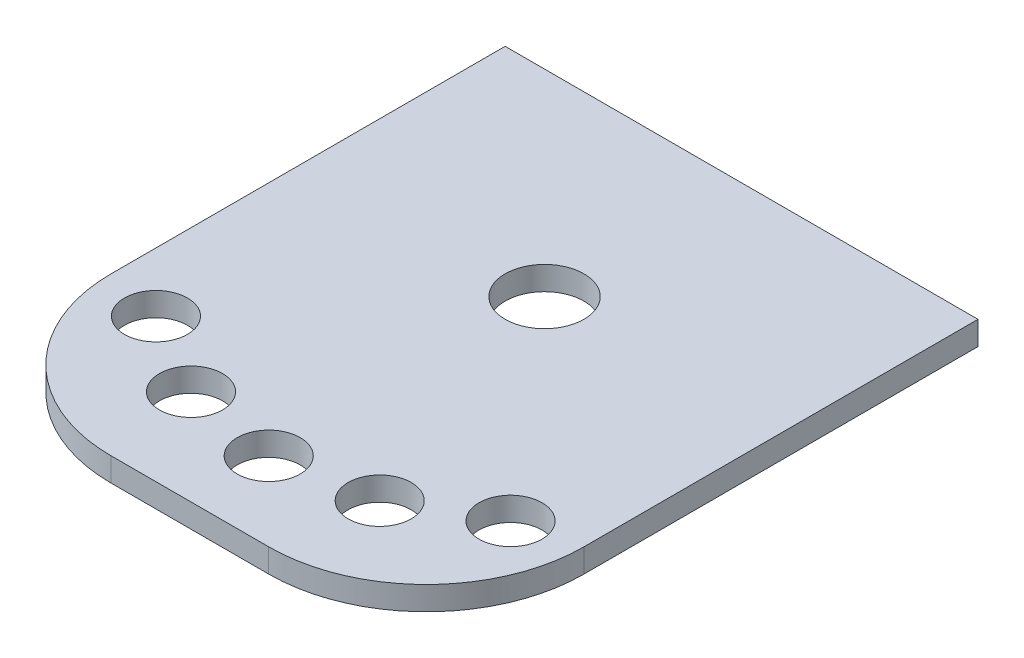
ISO-10303-21;
HEADER;
FILE_DESCRIPTION(('STEP AP214'),'2;1');
FILE_NAME('part.step','',(''),(''),'','','');
FILE_SCHEMA(('AUTOMOTIVE_DESIGN { 1 0 10303 214 1 1 1 1 }'));
ENDSEC;
DATA;
#1=APPLICATION_CONTEXT('core data for automotive mechanical design processes');
#2=APPLICATION_PROTOCOL_DEFINITION('international standard','automotive_design',2000,#1);
#3=PRODUCT_CONTEXT('',#1,'mechanical');
#4=PRODUCT('Part','Part','',(#3));
#5=PRODUCT_RELATED_PRODUCT_CATEGORY('part','',(#4));
#6=PRODUCT_DEFINITION_FORMATION('','',#4);
#7=PRODUCT_DEFINITION_CONTEXT('part definition',#1,'design');
#8=PRODUCT_DEFINITION('design','',#6,#7);
#9=PRODUCT_DEFINITION_SHAPE('','',#8);
#10=(LENGTH_UNIT() NAMED_UNIT(*) SI_UNIT(.MILLI.,.METRE.));
#11=(NAMED_UNIT(*) PLANE_ANGLE_UNIT() SI_UNIT($,.RADIAN.));
#12=(NAMED_UNIT(*) SI_UNIT($,.STERADIAN.) SOLID_ANGLE_UNIT());
#13=UNCERTAINTY_MEASURE_WITH_UNIT(LENGTH_MEASURE(1.E-05),#10,'distance_accuracy_value','');
#14=(GEOMETRIC_REPRESENTATION_CONTEXT(3) GLOBAL_UNCERTAINTY_ASSIGNED_CONTEXT((#13)) GLOBAL_UNIT_ASSIGNED_CONTEXT((#10,
#11,#12)) REPRESENTATION_CONTEXT('',''));
#15=CARTESIAN_POINT('',(0.,0.,0.));
#16=DIRECTION('',(0.,0.,1.));
#17=DIRECTION('',(1.,0.,0.));
#18=AXIS2_PLACEMENT_3D('',#15,#16,#17);
#19=CARTESIAN_POINT('',(20.,-3.,0.));
#20=DIRECTION('',(0.,1.,0.));
#21=DIRECTION('',(0.,0.,1.));
#22=AXIS2_PLACEMENT_3D('',#19,#20,#21);
#23=CYLINDRICAL_SURFACE('',#22,20.);
#24=CARTESIAN_POINT('',(20.,0.,0.));
#25=DIRECTION('',(0.,1.,0.));
#26=DIRECTION('',(0.,0.,1.));
#27=AXIS2_PLACEMENT_3D('',#24,#25,#26);
#28=CIRCLE('',#27,20.);
#29=CARTESIAN_POINT('',(0.,0.,0.));
#30=VERTEX_POINT('',#29);
#31=CARTESIAN_POINT('',(20.,0.,20.));
#32=VERTEX_POINT('',#31);
#33=EDGE_CURVE('E120',#30,#32,#28,.T.);
#34=ORIENTED_EDGE('',*,*,#33,.F.);
#35=DIRECTION('',(0.,1.,0.));
#36=VECTOR('',#35,1.);
#37=CARTESIAN_POINT('',(0.,-3.,0.));
#38=LINE('',#37,#36);
#39=CARTESIAN_POINT('',(0.,-3.,0.));
#40=VERTEX_POINT('',#39);
#41=EDGE_CURVE('E11',#40,#30,#38,.T.);
#42=ORIENTED_EDGE('',*,*,#41,.F.);
#43=CARTESIAN_POINT('',(20.,-3.,0.));
#44=DIRECTION('',(0.,1.,0.));
#45=DIRECTION('',(0.,0.,1.));
#46=AXIS2_PLACEMENT_3D('',#43,#44,#45);
#47=CIRCLE('',#46,20.);
#48=CARTESIAN_POINT('',(20.,-3.,20.));
#49=VERTEX_POINT('',#48);
#50=EDGE_CURVE('E135',#40,#49,#47,.T.);
#51=ORIENTED_EDGE('',*,*,#50,.T.);
#52=DIRECTION('',(0.,1.,0.));
#53=VECTOR('',#52,1.);
#54=CARTESIAN_POINT('',(20.,-3.,20.));
#55=LINE('',#54,#53);
#56=EDGE_CURVE('E38',#49,#32,#55,.T.);
#57=ORIENTED_EDGE('',*,*,#56,.T.);
#58=EDGE_LOOP('',(#34,#42,#51,#57));
#59=FACE_BOUND('',#58,.T.);
#60=ADVANCED_FACE('F35',(#59),#23,.T.);
#61=CARTESIAN_POINT('',(0.,-3.,0.));
#62=DIRECTION('',(-1.,0.,0.));
#63=DIRECTION('',(0.,0.,1.));
#64=AXIS2_PLACEMENT_3D('',#61,#62,#63);
#65=PLANE('',#64);
#66=DIRECTION('',(0.,0.,1.));
#67=VECTOR('',#66,1.);
#68=CARTESIAN_POINT('',(0.,0.,0.));
#69=LINE('',#68,#67);
#70=CARTESIAN_POINT('',(0.,0.,-50.));
#71=VERTEX_POINT('',#70);
#72=EDGE_CURVE('E133',#71,#30,#69,.T.);
#73=ORIENTED_EDGE('',*,*,#72,.F.);
#74=DIRECTION('',(0.,1.,0.));
#75=VECTOR('',#74,1.);
#76=CARTESIAN_POINT('',(0.,-3.,-50.));
#77=LINE('',#76,#75);
#78=CARTESIAN_POINT('',(0.,-3.,-50.));
#79=VERTEX_POINT('',#78);
#80=EDGE_CURVE('E44',#79,#71,#77,.T.);
#81=ORIENTED_EDGE('',*,*,#80,.F.);
#82=DIRECTION('',(0.,0.,1.));
#83=VECTOR('',#82,1.);
#84=CARTESIAN_POINT('',(0.,-3.,0.));
#85=LINE('',#84,#83);
#86=EDGE_CURVE('E110',#79,#40,#85,.T.);
#87=ORIENTED_EDGE('',*,*,#86,.T.);
#88=ORIENTED_EDGE('',*,*,#41,.T.);
#89=EDGE_LOOP('',(#73,#81,#87,#88));
#90=FACE_BOUND('',#89,.T.);
#91=ADVANCED_FACE('F143',(#90),#65,.T.);
#92=CARTESIAN_POINT('',(0.,-3.,-50.));
#93=DIRECTION('',(0.,0.,-1.));
#94=DIRECTION('',(-1.,0.,0.));
#95=AXIS2_PLACEMENT_3D('',#92,#93,#94);
#96=PLANE('',#95);
#97=DIRECTION('',(-1.,0.,0.));
#98=VECTOR('',#97,1.);
#99=CARTESIAN_POINT('',(0.,0.,-50.));
#100=LINE('',#99,#98);
#101=CARTESIAN_POINT('',(60.,0.,-50.));
#102=VERTEX_POINT('',#101);
#103=EDGE_CURVE('E97',#102,#71,#100,.T.);
#104=ORIENTED_EDGE('',*,*,#103,.F.);
#105=DIRECTION('',(0.,1.,0.));
#106=VECTOR('',#105,1.);
#107=CARTESIAN_POINT('',(60.,-3.,-50.));
#108=LINE('',#107,#106);
#109=CARTESIAN_POINT('',(60.,-3.,-50.));
#110=VERTEX_POINT('',#109);
#111=EDGE_CURVE('E92',#110,#102,#108,.T.);
#112=ORIENTED_EDGE('',*,*,#111,.F.);
#113=DIRECTION('',(-1.,0.,0.));
#114=VECTOR('',#113,1.);
#115=CARTESIAN_POINT('',(0.,-3.,-50.));
#116=LINE('',#115,#114);
#117=EDGE_CURVE('E95',#110,#79,#116,.T.);
#118=ORIENTED_EDGE('',*,*,#117,.T.);
#119=ORIENTED_EDGE('',*,*,#80,.T.);
#120=EDGE_LOOP('',(#104,#112,#118,#119));
#121=FACE_BOUND('',#120,.T.);
#122=ADVANCED_FACE('F94',(#121),#96,.T.);
#123=CARTESIAN_POINT('',(60.,-3.,0.));
#124=DIRECTION('',(1.,0.,0.));
#125=DIRECTION('',(0.,0.,-1.));
#126=AXIS2_PLACEMENT_3D('',#123,#124,#125);
#127=PLANE('',#126);
#128=DIRECTION('',(0.,0.,-1.));
#129=VECTOR('',#128,1.);
#130=CARTESIAN_POINT('',(60.,0.,0.));
#131=LINE('',#130,#129);
#132=CARTESIAN_POINT('',(60.,0.,0.));
#133=VERTEX_POINT('',#132);
#134=EDGE_CURVE('E130',#133,#102,#131,.T.);
#135=ORIENTED_EDGE('',*,*,#134,.F.);
#136=DIRECTION('',(0.,1.,0.));
#137=VECTOR('',#136,1.);
#138=CARTESIAN_POINT('',(60.,-3.,0.));
#139=LINE('',#138,#137);
#140=CARTESIAN_POINT('',(60.,-3.,0.));
#141=VERTEX_POINT('',#140);
#142=EDGE_CURVE('E102',#141,#133,#139,.T.);
#143=ORIENTED_EDGE('',*,*,#142,.F.);
#144=DIRECTION('',(0.,0.,-1.));
#145=VECTOR('',#144,1.);
#146=CARTESIAN_POINT('',(60.,-3.,0.));
#147=LINE('',#146,#145);
#148=EDGE_CURVE('E108',#141,#110,#147,.T.);
#149=ORIENTED_EDGE('',*,*,#148,.T.);
#150=ORIENTED_EDGE('',*,*,#111,.T.);
#151=EDGE_LOOP('',(#135,#143,#149,#150));
#152=FACE_BOUND('',#151,.T.);
#153=ADVANCED_FACE('F112',(#152),#127,.T.);
#154=CARTESIAN_POINT('',(40.,-3.,0.));
#155=DIRECTION('',(0.,1.,0.));
#156=DIRECTION('',(0.,0.,1.));
#157=AXIS2_PLACEMENT_3D('',#154,#155,#156);
#158=CYLINDRICAL_SURFACE('',#157,20.);
#159=CARTESIAN_POINT('',(40.,0.,0.));
#160=DIRECTION('',(0.,1.,0.));
#161=DIRECTION('',(0.,0.,1.));
#162=AXIS2_PLACEMENT_3D('',#159,#160,#161);
#163=CIRCLE('',#162,20.);
#164=CARTESIAN_POINT('',(40.,0.,20.));
#165=VERTEX_POINT('',#164);
#166=EDGE_CURVE('E127',#165,#133,#163,.T.);
#167=ORIENTED_EDGE('',*,*,#166,.F.);
#168=DIRECTION('',(0.,1.,0.));
#169=VECTOR('',#168,1.);
#170=CARTESIAN_POINT('',(40.,-3.,20.));
#171=LINE('',#170,#169);
#172=CARTESIAN_POINT('',(40.,-3.,20.));
#173=VERTEX_POINT('',#172);
#174=EDGE_CURVE('E138',#173,#165,#171,.T.);
#175=ORIENTED_EDGE('',*,*,#174,.F.);
#176=CARTESIAN_POINT('',(40.,-3.,0.));
#177=DIRECTION('',(0.,1.,0.));
#178=DIRECTION('',(0.,0.,1.));
#179=AXIS2_PLACEMENT_3D('',#176,#177,#178);
#180=CIRCLE('',#179,20.);
#181=EDGE_CURVE('E113',#173,#141,#180,.T.);
#182=ORIENTED_EDGE('',*,*,#181,.T.);
#183=ORIENTED_EDGE('',*,*,#142,.T.);
#184=EDGE_LOOP('',(#167,#175,#182,#183));
#185=FACE_BOUND('',#184,.T.);
#186=ADVANCED_FACE('F156',(#185),#158,.T.);
#187=CARTESIAN_POINT('',(20.,-3.,20.));
#188=DIRECTION('',(0.,0.,1.));
#189=DIRECTION('',(1.,0.,0.));
#190=AXIS2_PLACEMENT_3D('',#187,#188,#189);
#191=PLANE('',#190);
#192=DIRECTION('',(1.,0.,0.));
#193=VECTOR('',#192,1.);
#194=CARTESIAN_POINT('',(20.,0.,20.));
#195=LINE('',#194,#193);
#196=EDGE_CURVE('E123',#32,#165,#195,.T.);
#197=ORIENTED_EDGE('',*,*,#196,.F.);
#198=ORIENTED_EDGE('',*,*,#56,.F.);
#199=DIRECTION('',(1.,0.,0.));
#200=VECTOR('',#199,1.);
#201=CARTESIAN_POINT('',(20.,-3.,20.));
#202=LINE('',#201,#200);
#203=EDGE_CURVE('E115',#49,#173,#202,.T.);
#204=ORIENTED_EDGE('',*,*,#203,.T.);
#205=ORIENTED_EDGE('',*,*,#174,.T.);
#206=EDGE_LOOP('',(#197,#198,#204,#205));
#207=FACE_BOUND('',#206,.T.);
#208=ADVANCED_FACE('F140',(#207),#191,.T.);
#209=CARTESIAN_POINT('',(20.,-3.,0.));
#210=DIRECTION('',(0.,1.,0.));
#211=DIRECTION('',(0.,0.,1.));
#212=AXIS2_PLACEMENT_3D('',#209,#210,#211);
#213=PLANE('',#212);
#214=CARTESIAN_POINT('',(30.,-3.,-25.));
#215=DIRECTION('',(0.,1.,0.));
#216=DIRECTION('',(0.,0.,1.));
#217=AXIS2_PLACEMENT_3D('',#214,#215,#216);
#218=CIRCLE('',#217,5.);
#219=CARTESIAN_POINT('',(30.,-3.,-20.));
#220=VERTEX_POINT('',#219);
#221=EDGE_CURVE('E198',#220,#220,#218,.T.);
#222=ORIENTED_EDGE('',*,*,#221,.T.);
#223=EDGE_LOOP('',(#222));
#224=FACE_BOUND('',#223,.T.);
#225=CARTESIAN_POINT('',(7.5024336609711,-3.,1.8115555091642));
#226=DIRECTION('',(0.,1.,0.));
#227=DIRECTION('',(0.,0.,1.));
#228=AXIS2_PLACEMENT_3D('',#225,#226,#227);
#229=CIRCLE('',#228,4.);
#230=CARTESIAN_POINT('',(7.5024336609711,-3.,5.81155550916421));
#231=VERTEX_POINT('',#230);
#232=EDGE_CURVE('E206',#231,#231,#229,.T.);
#233=ORIENTED_EDGE('',*,*,#232,.T.);
#234=EDGE_LOOP('',(#233));
#235=FACE_BOUND('',#234,.T.);
#236=CARTESIAN_POINT('',(18.0292949836016,-3.,7.88924172750677));
#237=DIRECTION('',(0.,1.,0.));
#238=DIRECTION('',(0.,0.,1.));
#239=AXIS2_PLACEMENT_3D('',#236,#237,#238);
#240=CIRCLE('',#239,4.);
#241=CARTESIAN_POINT('',(18.0292949836016,-3.,11.8892417275068));
#242=VERTEX_POINT('',#241);
#243=EDGE_CURVE('E212',#242,#242,#240,.T.);
#244=ORIENTED_EDGE('',*,*,#243,.T.);
#245=EDGE_LOOP('',(#244));
#246=FACE_BOUND('',#245,.T.);
#247=CARTESIAN_POINT('',(41.9707050163984,-3.,7.88924172750677));
#248=DIRECTION('',(0.,1.,0.));
#249=DIRECTION('',(0.,0.,-1.));
#250=AXIS2_PLACEMENT_3D('',#247,#248,#249);
#251=CIRCLE('',#250,4.);
#252=CARTESIAN_POINT('',(41.9707050163984,-3.,3.88924172750677));
#253=VERTEX_POINT('',#252);
#254=EDGE_CURVE('E218',#253,#253,#251,.T.);
#255=ORIENTED_EDGE('',*,*,#254,.T.);
#256=EDGE_LOOP('',(#255));
#257=FACE_BOUND('',#256,.T.);
#258=CARTESIAN_POINT('',(30.,-3.,9.99999999999998));
#259=DIRECTION('',(0.,1.,0.));
#260=DIRECTION('',(0.,0.,1.));
#261=AXIS2_PLACEMENT_3D('',#258,#259,#260);
#262=CIRCLE('',#261,4.00000000000001);
#263=CARTESIAN_POINT('',(30.,-3.,14.));
#264=VERTEX_POINT('',#263);
#265=EDGE_CURVE('E224',#264,#264,#262,.T.);
#266=ORIENTED_EDGE('',*,*,#265,.T.);
#267=EDGE_LOOP('',(#266));
#268=FACE_BOUND('',#267,.T.);
#269=CARTESIAN_POINT('',(52.4975663390289,-3.,1.8115555091642));
#270=DIRECTION('',(0.,1.,0.));
#271=DIRECTION('',(0.,0.,-1.));
#272=AXIS2_PLACEMENT_3D('',#269,#270,#271);
#273=CIRCLE('',#272,4.);
#274=CARTESIAN_POINT('',(52.4975663390289,-3.,-2.1884444908358));
#275=VERTEX_POINT('',#274);
#276=EDGE_CURVE('E124',#275,#275,#273,.T.);
#277=ORIENTED_EDGE('',*,*,#276,.T.);
#278=EDGE_LOOP('',(#277));
#279=FACE_BOUND('',#278,.T.);
#280=ORIENTED_EDGE('',*,*,#50,.F.);
#281=ORIENTED_EDGE('',*,*,#86,.F.);
#282=ORIENTED_EDGE('',*,*,#117,.F.);
#283=ORIENTED_EDGE('',*,*,#148,.F.);
#284=ORIENTED_EDGE('',*,*,#181,.F.);
#285=ORIENTED_EDGE('',*,*,#203,.F.);
#286=EDGE_LOOP('',(#280,#281,#282,#283,#284,#285));
#287=FACE_BOUND('',#286,.T.);
#288=ADVANCED_FACE('F106',(#224,#235,#246,#257,#268,#279,#287),#213,.F.);
#289=CARTESIAN_POINT('',(20.,0.,0.));
#290=DIRECTION('',(0.,1.,0.));
#291=DIRECTION('',(0.,0.,1.));
#292=AXIS2_PLACEMENT_3D('',#289,#290,#291);
#293=PLANE('',#292);
#294=CARTESIAN_POINT('',(30.,0.,-25.));
#295=DIRECTION('',(0.,1.,0.));
#296=DIRECTION('',(0.,0.,1.));
#297=AXIS2_PLACEMENT_3D('',#294,#295,#296);
#298=CIRCLE('',#297,5.);
#299=CARTESIAN_POINT('',(30.,0.,-20.));
#300=VERTEX_POINT('',#299);
#301=EDGE_CURVE('E201',#300,#300,#298,.T.);
#302=ORIENTED_EDGE('',*,*,#301,.F.);
#303=EDGE_LOOP('',(#302));
#304=FACE_BOUND('',#303,.T.);
#305=CARTESIAN_POINT('',(7.5024336609711,0.,1.8115555091642));
#306=DIRECTION('',(0.,1.,0.));
#307=DIRECTION('',(0.,0.,1.));
#308=AXIS2_PLACEMENT_3D('',#305,#306,#307);
#309=CIRCLE('',#308,4.);
#310=CARTESIAN_POINT('',(7.5024336609711,0.,5.81155550916421));
#311=VERTEX_POINT('',#310);
#312=EDGE_CURVE('E203',#311,#311,#309,.T.);
#313=ORIENTED_EDGE('',*,*,#312,.F.);
#314=EDGE_LOOP('',(#313));
#315=FACE_BOUND('',#314,.T.);
#316=CARTESIAN_POINT('',(18.0292949836016,0.,7.88924172750677));
#317=DIRECTION('',(0.,1.,0.));
#318=DIRECTION('',(0.,0.,1.));
#319=AXIS2_PLACEMENT_3D('',#316,#317,#318);
#320=CIRCLE('',#319,4.);
#321=CARTESIAN_POINT('',(18.0292949836016,0.,11.8892417275068));
#322=VERTEX_POINT('',#321);
#323=EDGE_CURVE('E209',#322,#322,#320,.T.);
#324=ORIENTED_EDGE('',*,*,#323,.F.);
#325=EDGE_LOOP('',(#324));
#326=FACE_BOUND('',#325,.T.);
#327=CARTESIAN_POINT('',(41.9707050163984,0.,7.88924172750677));
#328=DIRECTION('',(0.,1.,0.));
#329=DIRECTION('',(0.,0.,-1.));
#330=AXIS2_PLACEMENT_3D('',#327,#328,#329);
#331=CIRCLE('',#330,4.);
#332=CARTESIAN_POINT('',(41.9707050163984,0.,3.88924172750677));
#333=VERTEX_POINT('',#332);
#334=EDGE_CURVE('E215',#333,#333,#331,.T.);
#335=ORIENTED_EDGE('',*,*,#334,.F.);
#336=EDGE_LOOP('',(#335));
#337=FACE_BOUND('',#336,.T.);
#338=CARTESIAN_POINT('',(30.,0.,9.99999999999998));
#339=DIRECTION('',(0.,1.,0.));
#340=DIRECTION('',(0.,0.,1.));
#341=AXIS2_PLACEMENT_3D('',#338,#339,#340);
#342=CIRCLE('',#341,4.00000000000001);
#343=CARTESIAN_POINT('',(30.,0.,14.));
#344=VERTEX_POINT('',#343);
#345=EDGE_CURVE('E221',#344,#344,#342,.T.);
#346=ORIENTED_EDGE('',*,*,#345,.F.);
#347=EDGE_LOOP('',(#346));
#348=FACE_BOUND('',#347,.T.);
#349=CARTESIAN_POINT('',(52.4975663390289,0.,1.8115555091642));
#350=DIRECTION('',(0.,1.,0.));
#351=DIRECTION('',(0.,0.,-1.));
#352=AXIS2_PLACEMENT_3D('',#349,#350,#351);
#353=CIRCLE('',#352,4.);
#354=CARTESIAN_POINT('',(52.4975663390289,0.,-2.1884444908358));
#355=VERTEX_POINT('',#354);
#356=EDGE_CURVE('E227',#355,#355,#353,.T.);
#357=ORIENTED_EDGE('',*,*,#356,.F.);
#358=EDGE_LOOP('',(#357));
#359=FACE_BOUND('',#358,.T.);
#360=ORIENTED_EDGE('',*,*,#33,.T.);
#361=ORIENTED_EDGE('',*,*,#196,.T.);
#362=ORIENTED_EDGE('',*,*,#166,.T.);
#363=ORIENTED_EDGE('',*,*,#134,.T.);
#364=ORIENTED_EDGE('',*,*,#103,.T.);
#365=ORIENTED_EDGE('',*,*,#72,.T.);
#366=EDGE_LOOP('',(#360,#361,#362,#363,#364,#365));
#367=FACE_BOUND('',#366,.T.);
#368=ADVANCED_FACE('F142',(#304,#315,#326,#337,#348,#359,#367),#293,.T.);
#369=CARTESIAN_POINT('',(52.4975663390289,-3.,1.8115555091642));
#370=DIRECTION('',(0.,1.,0.));
#371=DIRECTION('',(0.,0.,1.));
#372=AXIS2_PLACEMENT_3D('',#369,#370,#371);
#373=CYLINDRICAL_SURFACE('',#372,4.);
#374=ORIENTED_EDGE('',*,*,#276,.F.);
#375=EDGE_LOOP('',(#374));
#376=FACE_BOUND('',#375,.T.);
#377=ORIENTED_EDGE('',*,*,#356,.T.);
#378=EDGE_LOOP('',(#377));
#379=FACE_BOUND('',#378,.T.);
#380=ADVANCED_FACE('F167',(#376,#379),#373,.F.);
#381=CARTESIAN_POINT('',(30.,-3.,9.99999999999998));
#382=DIRECTION('',(0.,1.,0.));
#383=DIRECTION('',(0.,0.,1.));
#384=AXIS2_PLACEMENT_3D('',#381,#382,#383);
#385=CYLINDRICAL_SURFACE('',#384,4.00000000000001);
#386=ORIENTED_EDGE('',*,*,#265,.F.);
#387=EDGE_LOOP('',(#386));
#388=FACE_BOUND('',#387,.T.);
#389=ORIENTED_EDGE('',*,*,#345,.T.);
#390=EDGE_LOOP('',(#389));
#391=FACE_BOUND('',#390,.T.);
#392=ADVANCED_FACE('F174',(#388,#391),#385,.F.);
#393=CARTESIAN_POINT('',(41.9707050163984,-3.,7.88924172750677));
#394=DIRECTION('',(0.,1.,0.));
#395=DIRECTION('',(0.,0.,1.));
#396=AXIS2_PLACEMENT_3D('',#393,#394,#395);
#397=CYLINDRICAL_SURFACE('',#396,4.);
#398=ORIENTED_EDGE('',*,*,#254,.F.);
#399=EDGE_LOOP('',(#398));
#400=FACE_BOUND('',#399,.T.);
#401=ORIENTED_EDGE('',*,*,#334,.T.);
#402=EDGE_LOOP('',(#401));
#403=FACE_BOUND('',#402,.T.);
#404=ADVANCED_FACE('F178',(#400,#403),#397,.F.);
#405=CARTESIAN_POINT('',(18.0292949836016,-3.,7.88924172750677));
#406=DIRECTION('',(0.,1.,0.));
#407=DIRECTION('',(0.,0.,1.));
#408=AXIS2_PLACEMENT_3D('',#405,#406,#407);
#409=CYLINDRICAL_SURFACE('',#408,4.);
#410=ORIENTED_EDGE('',*,*,#243,.F.);
#411=EDGE_LOOP('',(#410));
#412=FACE_BOUND('',#411,.T.);
#413=ORIENTED_EDGE('',*,*,#323,.T.);
#414=EDGE_LOOP('',(#413));
#415=FACE_BOUND('',#414,.T.);
#416=ADVANCED_FACE('F182',(#412,#415),#409,.F.);
#417=CARTESIAN_POINT('',(7.5024336609711,-3.,1.8115555091642));
#418=DIRECTION('',(0.,1.,0.));
#419=DIRECTION('',(0.,0.,1.));
#420=AXIS2_PLACEMENT_3D('',#417,#418,#419);
#421=CYLINDRICAL_SURFACE('',#420,4.);
#422=ORIENTED_EDGE('',*,*,#232,.F.);
#423=EDGE_LOOP('',(#422));
#424=FACE_BOUND('',#423,.T.);
#425=ORIENTED_EDGE('',*,*,#312,.T.);
#426=EDGE_LOOP('',(#425));
#427=FACE_BOUND('',#426,.T.);
#428=ADVANCED_FACE('F186',(#424,#427),#421,.F.);
#429=CARTESIAN_POINT('',(30.,-3.,-25.));
#430=DIRECTION('',(0.,1.,0.));
#431=DIRECTION('',(0.,0.,1.));
#432=AXIS2_PLACEMENT_3D('',#429,#430,#431);
#433=CYLINDRICAL_SURFACE('',#432,5.);
#434=ORIENTED_EDGE('',*,*,#221,.F.);
#435=EDGE_LOOP('',(#434));
#436=FACE_BOUND('',#435,.T.);
#437=ORIENTED_EDGE('',*,*,#301,.T.);
#438=EDGE_LOOP('',(#437));
#439=FACE_BOUND('',#438,.T.);
#440=ADVANCED_FACE('F190',(#436,#439),#433,.F.);
#441=CLOSED_SHELL('',(#60,#91,#122,#153,#186,#208,#288,#368,#380,#392,#404,#416,#428,#440));
#442=MANIFOLD_SOLID_BREP('B2',#441);
#443=ADVANCED_BREP_SHAPE_REPRESENTATION('',(#18,#442),#14);
#444=SHAPE_DEFINITION_REPRESENTATION(#9,#443);
ENDSEC;
END-ISO-10303-21;
